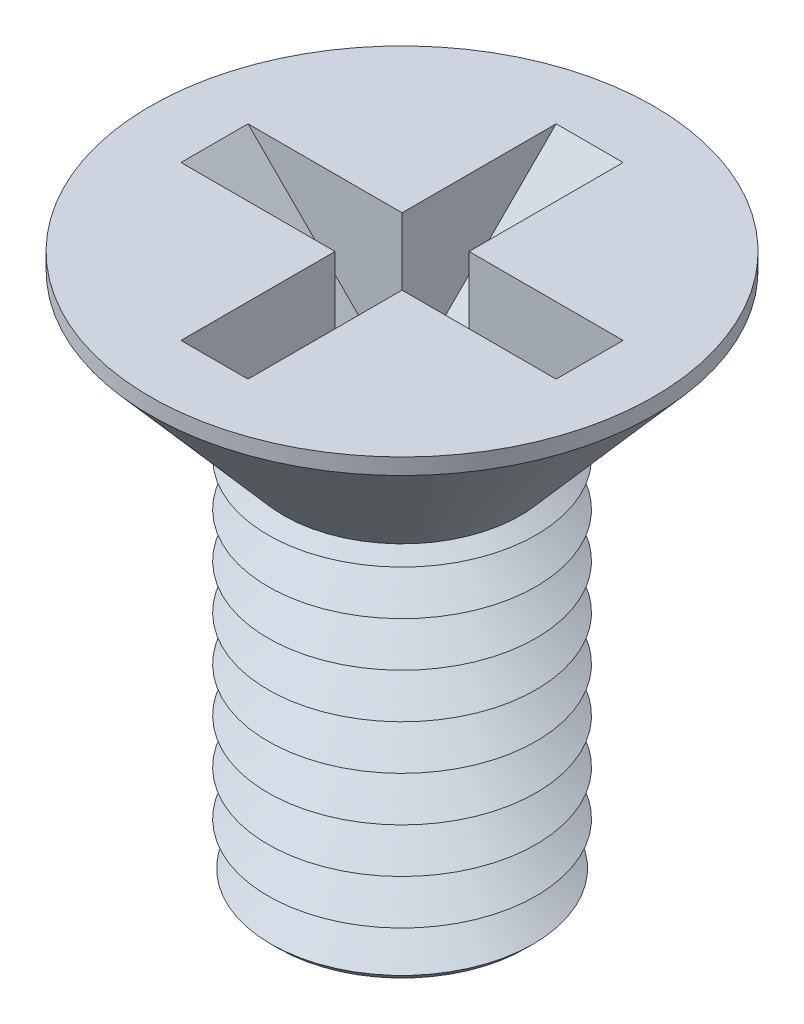
ISO-10303-21;
HEADER;
FILE_DESCRIPTION(('STEP AP214'),'2;1');
FILE_NAME('part.step','',(''),(''),'','','');
FILE_SCHEMA(('AUTOMOTIVE_DESIGN { 1 0 10303 214 1 1 1 1 }'));
ENDSEC;
DATA;
#1=APPLICATION_CONTEXT('core data for automotive mechanical design processes');
#2=APPLICATION_PROTOCOL_DEFINITION('international standard','automotive_design',2000,#1);
#3=PRODUCT_CONTEXT('',#1,'mechanical');
#4=PRODUCT('Part','Part','',(#3));
#5=PRODUCT_RELATED_PRODUCT_CATEGORY('part','',(#4));
#6=PRODUCT_DEFINITION_FORMATION('','',#4);
#7=PRODUCT_DEFINITION_CONTEXT('part definition',#1,'design');
#8=PRODUCT_DEFINITION('design','',#6,#7);
#9=PRODUCT_DEFINITION_SHAPE('','',#8);
#10=(LENGTH_UNIT() NAMED_UNIT(*) SI_UNIT(.MILLI.,.METRE.));
#11=(NAMED_UNIT(*) PLANE_ANGLE_UNIT() SI_UNIT($,.RADIAN.));
#12=(NAMED_UNIT(*) SI_UNIT($,.STERADIAN.) SOLID_ANGLE_UNIT());
#13=UNCERTAINTY_MEASURE_WITH_UNIT(LENGTH_MEASURE(1.E-05),#10,'distance_accuracy_value','');
#14=(GEOMETRIC_REPRESENTATION_CONTEXT(3) GLOBAL_UNCERTAINTY_ASSIGNED_CONTEXT((#13)) GLOBAL_UNIT_ASSIGNED_CONTEXT((#10,
#11,#12)) REPRESENTATION_CONTEXT('',''));
#15=CARTESIAN_POINT('',(0.,0.,0.));
#16=DIRECTION('',(0.,0.,1.));
#17=DIRECTION('',(1.,0.,0.));
#18=AXIS2_PLACEMENT_3D('',#15,#16,#17);
#19=CARTESIAN_POINT('',(0.762,0.,0.));
#20=DIRECTION('',(0.,1.,0.));
#21=DIRECTION('',(0.,0.,1.));
#22=AXIS2_PLACEMENT_3D('',#19,#20,#21);
#23=PLANE('',#22);
#24=CARTESIAN_POINT('',(0.,0.,0.));
#25=DIRECTION('',(0.,-1.,0.));
#26=DIRECTION('',(0.,0.,-1.));
#27=AXIS2_PLACEMENT_3D('',#24,#25,#26);
#28=CIRCLE('',#27,1.43181242069409);
#29=CARTESIAN_POINT('',(0.,0.,-1.43181242069409));
#30=VERTEX_POINT('',#29);
#31=EDGE_CURVE('E172',#30,#30,#28,.T.);
#32=ORIENTED_EDGE('',*,*,#31,.F.);
#33=EDGE_LOOP('',(#32));
#34=FACE_BOUND('',#33,.T.);
#35=DIRECTION('',(0.,0.,1.));
#36=VECTOR('',#35,1.);
#37=CARTESIAN_POINT('',(-1.06679999999999,0.,0.));
#38=LINE('',#37,#36);
#39=CARTESIAN_POINT('',(-1.06679999999999,0.,-0.190499999999996));
#40=VERTEX_POINT('',#39);
#41=CARTESIAN_POINT('',(-1.06679999999999,0.,0.190500000000004));
#42=VERTEX_POINT('',#41);
#43=EDGE_CURVE('E110',#40,#42,#38,.T.);
#44=ORIENTED_EDGE('',*,*,#43,.F.);
#45=DIRECTION('',(1.,0.,0.));
#46=VECTOR('',#45,1.);
#47=CARTESIAN_POINT('',(0.761999999999999,0.,-0.190500000000003));
#48=LINE('',#47,#46);
#49=CARTESIAN_POINT('',(-0.1905,0.,-0.190499999999999));
#50=VERTEX_POINT('',#49);
#51=EDGE_CURVE('E159',#40,#50,#48,.T.);
#52=ORIENTED_EDGE('',*,*,#51,.T.);
#53=DIRECTION('',(0.,0.,1.));
#54=VECTOR('',#53,1.);
#55=CARTESIAN_POINT('',(-0.1905,0.,0.));
#56=LINE('',#55,#54);
#57=CARTESIAN_POINT('',(-0.1905,0.,-1.06679999999999));
#58=VERTEX_POINT('',#57);
#59=EDGE_CURVE('E237',#58,#50,#56,.T.);
#60=ORIENTED_EDGE('',*,*,#59,.F.);
#61=DIRECTION('',(-1.,0.,0.));
#62=VECTOR('',#61,1.);
#63=CARTESIAN_POINT('',(0.762,0.,-1.06679999999999));
#64=LINE('',#63,#62);
#65=CARTESIAN_POINT('',(0.1905,0.,-1.06679999999999));
#66=VERTEX_POINT('',#65);
#67=EDGE_CURVE('E46',#66,#58,#64,.T.);
#68=ORIENTED_EDGE('',*,*,#67,.F.);
#69=DIRECTION('',(0.,0.,1.));
#70=VECTOR('',#69,1.);
#71=CARTESIAN_POINT('',(0.1905,0.,0.));
#72=LINE('',#71,#70);
#73=CARTESIAN_POINT('',(0.1905,0.,-0.190500000000001));
#74=VERTEX_POINT('',#73);
#75=EDGE_CURVE('E54',#66,#74,#72,.T.);
#76=ORIENTED_EDGE('',*,*,#75,.T.);
#77=CARTESIAN_POINT('',(1.06679999999999,0.,-0.190500000000011));
#78=VERTEX_POINT('',#77);
#79=EDGE_CURVE('E155',#74,#78,#48,.T.);
#80=ORIENTED_EDGE('',*,*,#79,.T.);
#81=DIRECTION('',(0.,0.,-1.));
#82=VECTOR('',#81,1.);
#83=CARTESIAN_POINT('',(1.06679999999999,0.,0.));
#84=LINE('',#83,#82);
#85=CARTESIAN_POINT('',(1.06679999999999,0.,0.190499999999989));
#86=VERTEX_POINT('',#85);
#87=EDGE_CURVE('E153',#86,#78,#84,.T.);
#88=ORIENTED_EDGE('',*,*,#87,.F.);
#89=DIRECTION('',(-1.,0.,0.));
#90=VECTOR('',#89,1.);
#91=CARTESIAN_POINT('',(0.762000000000001,0.,0.190499999999992));
#92=LINE('',#91,#90);
#93=CARTESIAN_POINT('',(0.1905,0.,0.190499999999998));
#94=VERTEX_POINT('',#93);
#95=EDGE_CURVE('E136',#86,#94,#92,.T.);
#96=ORIENTED_EDGE('',*,*,#95,.T.);
#97=DIRECTION('',(0.,0.,-1.));
#98=VECTOR('',#97,1.);
#99=CARTESIAN_POINT('',(0.1905,0.,0.));
#100=LINE('',#99,#98);
#101=CARTESIAN_POINT('',(0.1905,0.,1.06679999999999));
#102=VERTEX_POINT('',#101);
#103=EDGE_CURVE('E131',#102,#94,#100,.T.);
#104=ORIENTED_EDGE('',*,*,#103,.F.);
#105=DIRECTION('',(1.,0.,0.));
#106=VECTOR('',#105,1.);
#107=CARTESIAN_POINT('',(0.762,0.,1.06679999999999));
#108=LINE('',#107,#106);
#109=CARTESIAN_POINT('',(-0.1905,0.,1.06679999999999));
#110=VERTEX_POINT('',#109);
#111=EDGE_CURVE('E140',#110,#102,#108,.T.);
#112=ORIENTED_EDGE('',*,*,#111,.F.);
#113=DIRECTION('',(0.,0.,-1.));
#114=VECTOR('',#113,1.);
#115=CARTESIAN_POINT('',(-0.1905,0.,0.));
#116=LINE('',#115,#114);
#117=CARTESIAN_POINT('',(-0.1905,0.,0.190500000000001));
#118=VERTEX_POINT('',#117);
#119=EDGE_CURVE('E39',#110,#118,#116,.T.);
#120=ORIENTED_EDGE('',*,*,#119,.T.);
#121=DIRECTION('',(1.,0.,0.));
#122=VECTOR('',#121,1.);
#123=CARTESIAN_POINT('',(0.762,0.,0.190499999999997));
#124=LINE('',#123,#122);
#125=EDGE_CURVE('E11',#42,#118,#124,.T.);
#126=ORIENTED_EDGE('',*,*,#125,.F.);
#127=EDGE_LOOP('',(#44,#52,#60,#68,#76,#80,#88,#96,#104,#112,#120,#126));
#128=FACE_BOUND('',#127,.T.);
#129=ADVANCED_FACE('F32',(#34,#128),#23,.T.);
#130=CARTESIAN_POINT('',(-0.1905,0.508,0.));
#131=DIRECTION('',(-1.,0.,0.));
#132=DIRECTION('',(0.,0.,1.));
#133=AXIS2_PLACEMENT_3D('',#130,#131,#132);
#134=PLANE('',#133);
#135=DIRECTION('',(0.,1.,0.));
#136=VECTOR('',#135,1.);
#137=CARTESIAN_POINT('',(-0.1905,0.508,-0.190499999999999));
#138=LINE('',#137,#136);
#139=CARTESIAN_POINT('',(-0.190499999999999,-0.8763,-0.190499999999999));
#140=VERTEX_POINT('',#139);
#141=EDGE_CURVE('E158',#140,#50,#138,.T.);
#142=ORIENTED_EDGE('',*,*,#141,.F.);
#143=DIRECTION('',(0.,0.707106781186551,-0.707106781186544));
#144=VECTOR('',#143,1.);
#145=CARTESIAN_POINT('',(-0.1905,0.508,-1.57479999999998));
#146=LINE('',#145,#144);
#147=EDGE_CURVE('E164',#140,#58,#146,.T.);
#148=ORIENTED_EDGE('',*,*,#147,.T.);
#149=ORIENTED_EDGE('',*,*,#59,.T.);
#150=EDGE_LOOP('',(#142,#148,#149));
#151=FACE_BOUND('',#150,.T.);
#152=ADVANCED_FACE('F262',(#151),#134,.F.);
#153=CARTESIAN_POINT('',(0.1905,0.508,0.));
#154=DIRECTION('',(-1.,0.,0.));
#155=DIRECTION('',(0.,0.,1.));
#156=AXIS2_PLACEMENT_3D('',#153,#154,#155);
#157=PLANE('',#156);
#158=DIRECTION('',(0.,0.707106781186551,-0.707106781186544));
#159=VECTOR('',#158,1.);
#160=CARTESIAN_POINT('',(0.1905,0.508,-1.57479999999998));
#161=LINE('',#160,#159);
#162=CARTESIAN_POINT('',(0.1905,-0.8763,-0.190499999999998));
#163=VERTEX_POINT('',#162);
#164=EDGE_CURVE('E109',#163,#66,#161,.T.);
#165=ORIENTED_EDGE('',*,*,#164,.F.);
#166=DIRECTION('',(0.,1.,0.));
#167=VECTOR('',#166,1.);
#168=CARTESIAN_POINT('',(0.1905,0.508,-0.190500000000001));
#169=LINE('',#168,#167);
#170=EDGE_CURVE('E240',#163,#74,#169,.T.);
#171=ORIENTED_EDGE('',*,*,#170,.T.);
#172=ORIENTED_EDGE('',*,*,#75,.F.);
#173=EDGE_LOOP('',(#165,#171,#172));
#174=FACE_BOUND('',#173,.T.);
#175=ADVANCED_FACE('F266',(#174),#157,.T.);
#176=CARTESIAN_POINT('',(0.,-2.92100000000001,0.));
#177=DIRECTION('',(0.,-1.,0.));
#178=DIRECTION('',(0.,0.,-1.));
#179=AXIS2_PLACEMENT_3D('',#176,#177,#178);
#180=CONICAL_SURFACE('',#179,0.542029547438751,1.04719755119662);
#181=CARTESIAN_POINT('',(0.,-3.03870295474388,0.));
#182=DIRECTION('',(0.,-1.,0.));
#183=DIRECTION('',(0.,0.,-1.));
#184=AXIS2_PLACEMENT_3D('',#181,#182,#183);
#185=CIRCLE('',#184,0.745897045256119);
#186=CARTESIAN_POINT('',(0.,-3.03870295474388,-0.745897045256119));
#187=VERTEX_POINT('',#186);
#188=EDGE_CURVE('E227',#187,#187,#185,.F.);
#189=ORIENTED_EDGE('',*,*,#188,.T.);
#190=EDGE_LOOP('',(#189));
#191=FACE_BOUND('',#190,.T.);
#192=CARTESIAN_POINT('',(0.,-2.92100000000001,0.));
#193=DIRECTION('',(0.,-1.,0.));
#194=DIRECTION('',(0.,0.,-1.));
#195=AXIS2_PLACEMENT_3D('',#192,#193,#194);
#196=CIRCLE('',#195,0.542029547438751);
#197=CARTESIAN_POINT('',(0.,-2.92100000000001,-0.542029547438751));
#198=VERTEX_POINT('',#197);
#199=EDGE_CURVE('E221',#198,#198,#196,.T.);
#200=ORIENTED_EDGE('',*,*,#199,.T.);
#201=EDGE_LOOP('',(#200));
#202=FACE_BOUND('',#201,.T.);
#203=ADVANCED_FACE('F268',(#191,#202),#180,.T.);
#204=CARTESIAN_POINT('',(0.,-2.79400000000001,0.));
#205=DIRECTION('',(0.,1.,0.));
#206=DIRECTION('',(0.,0.,1.));
#207=AXIS2_PLACEMENT_3D('',#204,#205,#206);
#208=CONICAL_SURFACE('',#207,0.762,1.04719755119659);
#209=ORIENTED_EDGE('',*,*,#199,.F.);
#210=EDGE_LOOP('',(#209));
#211=FACE_BOUND('',#210,.T.);
#212=CARTESIAN_POINT('',(0.,-2.79400000000001,0.));
#213=DIRECTION('',(0.,-1.,0.));
#214=DIRECTION('',(0.,0.,-1.));
#215=AXIS2_PLACEMENT_3D('',#212,#213,#214);
#216=CIRCLE('',#215,0.762);
#217=CARTESIAN_POINT('',(0.,-2.79400000000001,-0.762));
#218=VERTEX_POINT('',#217);
#219=EDGE_CURVE('E218',#218,#218,#216,.T.);
#220=ORIENTED_EDGE('',*,*,#219,.T.);
#221=EDGE_LOOP('',(#220));
#222=FACE_BOUND('',#221,.T.);
#223=ADVANCED_FACE('F274',(#211,#222),#208,.T.);
#224=CARTESIAN_POINT('',(0.,-2.66700000000001,0.));
#225=DIRECTION('',(0.,-1.,0.));
#226=DIRECTION('',(0.,0.,-1.));
#227=AXIS2_PLACEMENT_3D('',#224,#225,#226);
#228=CONICAL_SURFACE('',#227,0.542029547438751,1.04719755119659);
#229=ORIENTED_EDGE('',*,*,#219,.F.);
#230=EDGE_LOOP('',(#229));
#231=FACE_BOUND('',#230,.T.);
#232=CARTESIAN_POINT('',(0.,-2.66700000000001,0.));
#233=DIRECTION('',(0.,-1.,0.));
#234=DIRECTION('',(0.,0.,-1.));
#235=AXIS2_PLACEMENT_3D('',#232,#233,#234);
#236=CIRCLE('',#235,0.542029547438751);
#237=CARTESIAN_POINT('',(0.,-2.66700000000001,-0.542029547438751));
#238=VERTEX_POINT('',#237);
#239=EDGE_CURVE('E215',#238,#238,#236,.T.);
#240=ORIENTED_EDGE('',*,*,#239,.T.);
#241=EDGE_LOOP('',(#240));
#242=FACE_BOUND('',#241,.T.);
#243=ADVANCED_FACE('F360',(#231,#242),#228,.T.);
#244=CARTESIAN_POINT('',(0.,-2.54000000000001,0.));
#245=DIRECTION('',(0.,1.,0.));
#246=DIRECTION('',(0.,0.,1.));
#247=AXIS2_PLACEMENT_3D('',#244,#245,#246);
#248=CONICAL_SURFACE('',#247,0.762,1.04719755119662);
#249=ORIENTED_EDGE('',*,*,#239,.F.);
#250=EDGE_LOOP('',(#249));
#251=FACE_BOUND('',#250,.T.);
#252=CARTESIAN_POINT('',(0.,-2.54000000000001,0.));
#253=DIRECTION('',(0.,-1.,0.));
#254=DIRECTION('',(0.,0.,-1.));
#255=AXIS2_PLACEMENT_3D('',#252,#253,#254);
#256=CIRCLE('',#255,0.762);
#257=CARTESIAN_POINT('',(0.,-2.54000000000001,-0.762));
#258=VERTEX_POINT('',#257);
#259=EDGE_CURVE('E212',#258,#258,#256,.T.);
#260=ORIENTED_EDGE('',*,*,#259,.T.);
#261=EDGE_LOOP('',(#260));
#262=FACE_BOUND('',#261,.T.);
#263=ADVANCED_FACE('F356',(#251,#262),#248,.T.);
#264=CARTESIAN_POINT('',(0.,-2.41300000000001,0.));
#265=DIRECTION('',(0.,-1.,0.));
#266=DIRECTION('',(0.,0.,-1.));
#267=AXIS2_PLACEMENT_3D('',#264,#265,#266);
#268=CONICAL_SURFACE('',#267,0.542029547438751,1.04719755119659);
#269=ORIENTED_EDGE('',*,*,#259,.F.);
#270=EDGE_LOOP('',(#269));
#271=FACE_BOUND('',#270,.T.);
#272=CARTESIAN_POINT('',(0.,-2.41300000000001,0.));
#273=DIRECTION('',(0.,-1.,0.));
#274=DIRECTION('',(0.,0.,-1.));
#275=AXIS2_PLACEMENT_3D('',#272,#273,#274);
#276=CIRCLE('',#275,0.542029547438751);
#277=CARTESIAN_POINT('',(0.,-2.41300000000001,-0.542029547438751));
#278=VERTEX_POINT('',#277);
#279=EDGE_CURVE('E209',#278,#278,#276,.T.);
#280=ORIENTED_EDGE('',*,*,#279,.T.);
#281=EDGE_LOOP('',(#280));
#282=FACE_BOUND('',#281,.T.);
#283=ADVANCED_FACE('F352',(#271,#282),#268,.T.);
#284=CARTESIAN_POINT('',(0.,-2.28600000000001,0.));
#285=DIRECTION('',(0.,1.,0.));
#286=DIRECTION('',(0.,0.,1.));
#287=AXIS2_PLACEMENT_3D('',#284,#285,#286);
#288=CONICAL_SURFACE('',#287,0.762,1.04719755119659);
#289=ORIENTED_EDGE('',*,*,#279,.F.);
#290=EDGE_LOOP('',(#289));
#291=FACE_BOUND('',#290,.T.);
#292=CARTESIAN_POINT('',(0.,-2.28600000000001,0.));
#293=DIRECTION('',(0.,-1.,0.));
#294=DIRECTION('',(0.,0.,-1.));
#295=AXIS2_PLACEMENT_3D('',#292,#293,#294);
#296=CIRCLE('',#295,0.762);
#297=CARTESIAN_POINT('',(0.,-2.28600000000001,-0.762));
#298=VERTEX_POINT('',#297);
#299=EDGE_CURVE('E206',#298,#298,#296,.T.);
#300=ORIENTED_EDGE('',*,*,#299,.T.);
#301=EDGE_LOOP('',(#300));
#302=FACE_BOUND('',#301,.T.);
#303=ADVANCED_FACE('F348',(#291,#302),#288,.T.);
#304=CARTESIAN_POINT('',(0.,-2.15900000000001,0.));
#305=DIRECTION('',(0.,-1.,0.));
#306=DIRECTION('',(0.,0.,-1.));
#307=AXIS2_PLACEMENT_3D('',#304,#305,#306);
#308=CONICAL_SURFACE('',#307,0.542029547438751,1.04719755119659);
#309=ORIENTED_EDGE('',*,*,#299,.F.);
#310=EDGE_LOOP('',(#309));
#311=FACE_BOUND('',#310,.T.);
#312=CARTESIAN_POINT('',(0.,-2.15900000000001,0.));
#313=DIRECTION('',(0.,-1.,0.));
#314=DIRECTION('',(0.,0.,-1.));
#315=AXIS2_PLACEMENT_3D('',#312,#313,#314);
#316=CIRCLE('',#315,0.542029547438751);
#317=CARTESIAN_POINT('',(0.,-2.15900000000001,-0.542029547438751));
#318=VERTEX_POINT('',#317);
#319=EDGE_CURVE('E203',#318,#318,#316,.T.);
#320=ORIENTED_EDGE('',*,*,#319,.T.);
#321=EDGE_LOOP('',(#320));
#322=FACE_BOUND('',#321,.T.);
#323=ADVANCED_FACE('F344',(#311,#322),#308,.T.);
#324=CARTESIAN_POINT('',(0.,-2.03200000000001,0.));
#325=DIRECTION('',(0.,1.,0.));
#326=DIRECTION('',(0.,0.,1.));
#327=AXIS2_PLACEMENT_3D('',#324,#325,#326);
#328=CONICAL_SURFACE('',#327,0.762,1.04719755119659);
#329=ORIENTED_EDGE('',*,*,#319,.F.);
#330=EDGE_LOOP('',(#329));
#331=FACE_BOUND('',#330,.T.);
#332=CARTESIAN_POINT('',(0.,-2.03200000000001,0.));
#333=DIRECTION('',(0.,-1.,0.));
#334=DIRECTION('',(0.,0.,-1.));
#335=AXIS2_PLACEMENT_3D('',#332,#333,#334);
#336=CIRCLE('',#335,0.762);
#337=CARTESIAN_POINT('',(0.,-2.03200000000001,-0.762));
#338=VERTEX_POINT('',#337);
#339=EDGE_CURVE('E200',#338,#338,#336,.T.);
#340=ORIENTED_EDGE('',*,*,#339,.T.);
#341=EDGE_LOOP('',(#340));
#342=FACE_BOUND('',#341,.T.);
#343=ADVANCED_FACE('F340',(#331,#342),#328,.T.);
#344=CARTESIAN_POINT('',(0.,-1.90500000000001,0.));
#345=DIRECTION('',(0.,-1.,0.));
#346=DIRECTION('',(0.,0.,-1.));
#347=AXIS2_PLACEMENT_3D('',#344,#345,#346);
#348=CONICAL_SURFACE('',#347,0.542029547438751,1.04719755119662);
#349=ORIENTED_EDGE('',*,*,#339,.F.);
#350=EDGE_LOOP('',(#349));
#351=FACE_BOUND('',#350,.T.);
#352=CARTESIAN_POINT('',(0.,-1.90500000000001,0.));
#353=DIRECTION('',(0.,-1.,0.));
#354=DIRECTION('',(0.,0.,-1.));
#355=AXIS2_PLACEMENT_3D('',#352,#353,#354);
#356=CIRCLE('',#355,0.542029547438751);
#357=CARTESIAN_POINT('',(0.,-1.90500000000001,-0.542029547438751));
#358=VERTEX_POINT('',#357);
#359=EDGE_CURVE('E197',#358,#358,#356,.T.);
#360=ORIENTED_EDGE('',*,*,#359,.T.);
#361=EDGE_LOOP('',(#360));
#362=FACE_BOUND('',#361,.T.);
#363=ADVANCED_FACE('F336',(#351,#362),#348,.T.);
#364=CARTESIAN_POINT('',(0.,-1.77800000000001,0.));
#365=DIRECTION('',(0.,1.,0.));
#366=DIRECTION('',(0.,0.,1.));
#367=AXIS2_PLACEMENT_3D('',#364,#365,#366);
#368=CONICAL_SURFACE('',#367,0.762,1.04719755119659);
#369=ORIENTED_EDGE('',*,*,#359,.F.);
#370=EDGE_LOOP('',(#369));
#371=FACE_BOUND('',#370,.T.);
#372=CARTESIAN_POINT('',(0.,-1.77800000000001,0.));
#373=DIRECTION('',(0.,-1.,0.));
#374=DIRECTION('',(0.,0.,-1.));
#375=AXIS2_PLACEMENT_3D('',#372,#373,#374);
#376=CIRCLE('',#375,0.762);
#377=CARTESIAN_POINT('',(0.,-1.77800000000001,-0.762));
#378=VERTEX_POINT('',#377);
#379=EDGE_CURVE('E194',#378,#378,#376,.T.);
#380=ORIENTED_EDGE('',*,*,#379,.T.);
#381=EDGE_LOOP('',(#380));
#382=FACE_BOUND('',#381,.T.);
#383=ADVANCED_FACE('F332',(#371,#382),#368,.T.);
#384=CARTESIAN_POINT('',(0.,-1.65100000000001,0.));
#385=DIRECTION('',(0.,-1.,0.));
#386=DIRECTION('',(0.,0.,-1.));
#387=AXIS2_PLACEMENT_3D('',#384,#385,#386);
#388=CONICAL_SURFACE('',#387,0.542029547438751,1.04719755119659);
#389=ORIENTED_EDGE('',*,*,#379,.F.);
#390=EDGE_LOOP('',(#389));
#391=FACE_BOUND('',#390,.T.);
#392=CARTESIAN_POINT('',(0.,-1.65100000000001,0.));
#393=DIRECTION('',(0.,-1.,0.));
#394=DIRECTION('',(0.,0.,-1.));
#395=AXIS2_PLACEMENT_3D('',#392,#393,#394);
#396=CIRCLE('',#395,0.542029547438751);
#397=CARTESIAN_POINT('',(0.,-1.65100000000001,-0.542029547438751));
#398=VERTEX_POINT('',#397);
#399=EDGE_CURVE('E191',#398,#398,#396,.T.);
#400=ORIENTED_EDGE('',*,*,#399,.T.);
#401=EDGE_LOOP('',(#400));
#402=FACE_BOUND('',#401,.T.);
#403=ADVANCED_FACE('F328',(#391,#402),#388,.T.);
#404=CARTESIAN_POINT('',(0.,-1.52400000000001,0.));
#405=DIRECTION('',(0.,1.,0.));
#406=DIRECTION('',(0.,0.,1.));
#407=AXIS2_PLACEMENT_3D('',#404,#405,#406);
#408=CONICAL_SURFACE('',#407,0.762,1.04719755119662);
#409=ORIENTED_EDGE('',*,*,#399,.F.);
#410=EDGE_LOOP('',(#409));
#411=FACE_BOUND('',#410,.T.);
#412=CARTESIAN_POINT('',(0.,-1.52400000000001,0.));
#413=DIRECTION('',(0.,-1.,0.));
#414=DIRECTION('',(0.,0.,-1.));
#415=AXIS2_PLACEMENT_3D('',#412,#413,#414);
#416=CIRCLE('',#415,0.762);
#417=CARTESIAN_POINT('',(0.,-1.52400000000001,-0.762));
#418=VERTEX_POINT('',#417);
#419=EDGE_CURVE('E188',#418,#418,#416,.T.);
#420=ORIENTED_EDGE('',*,*,#419,.T.);
#421=EDGE_LOOP('',(#420));
#422=FACE_BOUND('',#421,.T.);
#423=ADVANCED_FACE('F324',(#411,#422),#408,.T.);
#424=CARTESIAN_POINT('',(0.,-1.39700000000001,0.));
#425=DIRECTION('',(0.,-1.,0.));
#426=DIRECTION('',(0.,0.,-1.));
#427=AXIS2_PLACEMENT_3D('',#424,#425,#426);
#428=CONICAL_SURFACE('',#427,0.542029547438751,1.04719755119659);
#429=ORIENTED_EDGE('',*,*,#419,.F.);
#430=EDGE_LOOP('',(#429));
#431=FACE_BOUND('',#430,.T.);
#432=CARTESIAN_POINT('',(0.,-1.39700000000001,0.));
#433=DIRECTION('',(0.,-1.,0.));
#434=DIRECTION('',(0.,0.,-1.));
#435=AXIS2_PLACEMENT_3D('',#432,#433,#434);
#436=CIRCLE('',#435,0.542029547438751);
#437=CARTESIAN_POINT('',(0.,-1.39700000000001,-0.542029547438751));
#438=VERTEX_POINT('',#437);
#439=EDGE_CURVE('E185',#438,#438,#436,.T.);
#440=ORIENTED_EDGE('',*,*,#439,.T.);
#441=EDGE_LOOP('',(#440));
#442=FACE_BOUND('',#441,.T.);
#443=ADVANCED_FACE('F320',(#431,#442),#428,.T.);
#444=CARTESIAN_POINT('',(0.,-1.27000000000001,0.));
#445=DIRECTION('',(0.,1.,0.));
#446=DIRECTION('',(0.,0.,1.));
#447=AXIS2_PLACEMENT_3D('',#444,#445,#446);
#448=CONICAL_SURFACE('',#447,0.762,1.04719755119659);
#449=ORIENTED_EDGE('',*,*,#439,.F.);
#450=EDGE_LOOP('',(#449));
#451=FACE_BOUND('',#450,.T.);
#452=CARTESIAN_POINT('',(0.,-1.27000000000001,0.));
#453=DIRECTION('',(0.,-1.,0.));
#454=DIRECTION('',(0.,0.,-1.));
#455=AXIS2_PLACEMENT_3D('',#452,#453,#454);
#456=CIRCLE('',#455,0.762);
#457=CARTESIAN_POINT('',(0.,-1.27000000000001,-0.762));
#458=VERTEX_POINT('',#457);
#459=EDGE_CURVE('E182',#458,#458,#456,.T.);
#460=ORIENTED_EDGE('',*,*,#459,.T.);
#461=EDGE_LOOP('',(#460));
#462=FACE_BOUND('',#461,.T.);
#463=ADVANCED_FACE('F313',(#451,#462),#448,.T.);
#464=CARTESIAN_POINT('',(0.,-1.14300000000001,0.));
#465=DIRECTION('',(0.,-1.,0.));
#466=DIRECTION('',(0.,0.,-1.));
#467=AXIS2_PLACEMENT_3D('',#464,#465,#466);
#468=CONICAL_SURFACE('',#467,0.542029547438751,1.04719755119659);
#469=ORIENTED_EDGE('',*,*,#459,.F.);
#470=EDGE_LOOP('',(#469));
#471=FACE_BOUND('',#470,.T.);
#472=CARTESIAN_POINT('',(0.,-1.14300000000001,0.));
#473=DIRECTION('',(0.,-1.,0.));
#474=DIRECTION('',(0.,0.,-1.));
#475=AXIS2_PLACEMENT_3D('',#472,#473,#474);
#476=CIRCLE('',#475,0.542029547438751);
#477=CARTESIAN_POINT('',(0.,-1.14300000000001,-0.542029547438751));
#478=VERTEX_POINT('',#477);
#479=EDGE_CURVE('E179',#478,#478,#476,.T.);
#480=ORIENTED_EDGE('',*,*,#479,.T.);
#481=EDGE_LOOP('',(#480));
#482=FACE_BOUND('',#481,.T.);
#483=ADVANCED_FACE('F307',(#471,#482),#468,.T.);
#484=CARTESIAN_POINT('',(0.,-1.016,0.));
#485=DIRECTION('',(0.,1.,0.));
#486=DIRECTION('',(0.,0.,1.));
#487=AXIS2_PLACEMENT_3D('',#484,#485,#486);
#488=CONICAL_SURFACE('',#487,0.762,1.04719755119659);
#489=ORIENTED_EDGE('',*,*,#479,.F.);
#490=EDGE_LOOP('',(#489));
#491=FACE_BOUND('',#490,.T.);
#492=CARTESIAN_POINT('',(0.,-1.016,0.));
#493=DIRECTION('',(0.,-1.,0.));
#494=DIRECTION('',(0.,0.,-1.));
#495=AXIS2_PLACEMENT_3D('',#492,#493,#494);
#496=CIRCLE('',#495,0.762);
#497=CARTESIAN_POINT('',(0.,-1.016,-0.762));
#498=VERTEX_POINT('',#497);
#499=EDGE_CURVE('E176',#498,#498,#496,.T.);
#500=ORIENTED_EDGE('',*,*,#499,.T.);
#501=EDGE_LOOP('',(#500));
#502=FACE_BOUND('',#501,.T.);
#503=ADVANCED_FACE('F302',(#491,#502),#488,.T.);
#504=CARTESIAN_POINT('',(0.,-0.889000000000008,0.));
#505=DIRECTION('',(0.,-1.,0.));
#506=DIRECTION('',(0.,0.,-1.));
#507=AXIS2_PLACEMENT_3D('',#504,#505,#506);
#508=CONICAL_SURFACE('',#507,0.542029547438751,1.04719755119662);
#509=CARTESIAN_POINT('',(0.,-0.964528276978587,0.));
#510=DIRECTION('',(0.,1.,0.));
#511=DIRECTION('',(0.,0.,1.));
#512=AXIS2_PLACEMENT_3D('',#509,#510,#511);
#513=CIRCLE('',#512,0.67284836057379);
#514=CARTESIAN_POINT('',(0.,-0.964528276978587,0.67284836057379));
#515=VERTEX_POINT('',#514);
#516=EDGE_CURVE('E175',#515,#515,#513,.F.);
#517=ORIENTED_EDGE('',*,*,#516,.T.);
#518=EDGE_LOOP('',(#517));
#519=FACE_BOUND('',#518,.T.);
#520=ORIENTED_EDGE('',*,*,#499,.F.);
#521=EDGE_LOOP('',(#520));
#522=FACE_BOUND('',#521,.T.);
#523=ADVANCED_FACE('F298',(#519,#522),#508,.T.);
#524=CARTESIAN_POINT('',(0.,-3.175,0.));
#525=DIRECTION('',(0.,1.,0.));
#526=DIRECTION('',(0.,0.,1.));
#527=AXIS2_PLACEMENT_3D('',#524,#525,#526);
#528=CONICAL_SURFACE('',#527,0.6096,0.785398163397457);
#529=CARTESIAN_POINT('',(0.,-3.08269704525615,0.));
#530=DIRECTION('',(0.,1.,0.));
#531=DIRECTION('',(0.,0.,1.));
#532=AXIS2_PLACEMENT_3D('',#529,#530,#531);
#533=CIRCLE('',#532,0.701902954743851);
#534=CARTESIAN_POINT('',(0.,-3.08269704525615,0.701902954743851));
#535=VERTEX_POINT('',#534);
#536=EDGE_CURVE('E230',#535,#535,#533,.F.);
#537=ORIENTED_EDGE('',*,*,#536,.F.);
#538=EDGE_LOOP('',(#537));
#539=FACE_BOUND('',#538,.T.);
#540=ORIENTED_EDGE('',*,*,#188,.F.);
#541=EDGE_LOOP('',(#540));
#542=FACE_BOUND('',#541,.T.);
#543=ADVANCED_FACE('F301',(#539,#542),#528,.T.);
#544=CARTESIAN_POINT('',(0.,-3.04800000000001,0.));
#545=DIRECTION('',(0.,1.,0.));
#546=DIRECTION('',(0.,0.,1.));
#547=AXIS2_PLACEMENT_3D('',#544,#545,#546);
#548=CONICAL_SURFACE('',#547,0.762,1.04719755119659);
#549=ORIENTED_EDGE('',*,*,#536,.T.);
#550=EDGE_LOOP('',(#549));
#551=FACE_BOUND('',#550,.T.);
#552=CARTESIAN_POINT('',(0.,-3.17500000000001,0.));
#553=DIRECTION('',(0.,-1.,0.));
#554=DIRECTION('',(0.,0.,-1.));
#555=AXIS2_PLACEMENT_3D('',#552,#553,#554);
#556=CIRCLE('',#555,0.542029547438751);
#557=CARTESIAN_POINT('',(0.,-3.17500000000001,-0.542029547438751));
#558=VERTEX_POINT('',#557);
#559=EDGE_CURVE('E224',#558,#558,#556,.T.);
#560=ORIENTED_EDGE('',*,*,#559,.F.);
#561=EDGE_LOOP('',(#560));
#562=FACE_BOUND('',#561,.T.);
#563=ADVANCED_FACE('F368',(#551,#562),#548,.T.);
#564=CARTESIAN_POINT('',(0.,-3.175,0.));
#565=DIRECTION('',(0.,-1.,0.));
#566=DIRECTION('',(0.,0.,-1.));
#567=AXIS2_PLACEMENT_3D('',#564,#565,#566);
#568=PLANE('',#567);
#569=ORIENTED_EDGE('',*,*,#559,.T.);
#570=EDGE_LOOP('',(#569));
#571=FACE_BOUND('',#570,.T.);
#572=ADVANCED_FACE('F294',(#571),#568,.T.);
#573=CARTESIAN_POINT('',(0.,-1.73855177383313,0.));
#574=DIRECTION('',(0.,1.,0.));
#575=DIRECTION('',(0.,0.,1.));
#576=AXIS2_PLACEMENT_3D('',#573,#574,#575);
#577=CONICAL_SURFACE('',#576,0.,0.715584993317668);
#578=CARTESIAN_POINT('',(0.,-0.0914399999999982,0.));
#579=DIRECTION('',(0.,-1.,0.));
#580=DIRECTION('',(0.,0.,-1.));
#581=AXIS2_PLACEMENT_3D('',#578,#579,#580);
#582=CIRCLE('',#581,1.43181242069409);
#583=CARTESIAN_POINT('',(0.,-0.0914399999999982,-1.43181242069409));
#584=VERTEX_POINT('',#583);
#585=EDGE_CURVE('E169',#584,#584,#582,.T.);
#586=ORIENTED_EDGE('',*,*,#585,.T.);
#587=EDGE_LOOP('',(#586));
#588=FACE_BOUND('',#587,.T.);
#589=ORIENTED_EDGE('',*,*,#516,.F.);
#590=EDGE_LOOP('',(#589));
#591=FACE_BOUND('',#590,.T.);
#592=ADVANCED_FACE('F288',(#588,#591),#577,.T.);
#593=CARTESIAN_POINT('',(0.,-50.,0.));
#594=DIRECTION('',(0.,-1.,0.));
#595=DIRECTION('',(0.,0.,-1.));
#596=AXIS2_PLACEMENT_3D('',#593,#594,#595);
#597=CYLINDRICAL_SURFACE('',#596,1.43181242069409);
#598=ORIENTED_EDGE('',*,*,#31,.T.);
#599=EDGE_LOOP('',(#598));
#600=FACE_BOUND('',#599,.T.);
#601=ORIENTED_EDGE('',*,*,#585,.F.);
#602=EDGE_LOOP('',(#601));
#603=FACE_BOUND('',#602,.T.);
#604=ADVANCED_FACE('F285',(#600,#603),#597,.T.);
#605=CARTESIAN_POINT('',(-0.1905,0.508,-1.57479999999998));
#606=DIRECTION('',(0.,-0.707106781186544,-0.707106781186551));
#607=DIRECTION('',(0.,0.707106781186551,-0.707106781186544));
#608=AXIS2_PLACEMENT_3D('',#605,#606,#607);
#609=PLANE('',#608);
#610=ORIENTED_EDGE('',*,*,#67,.T.);
#611=ORIENTED_EDGE('',*,*,#147,.F.);
#612=DIRECTION('',(1.,0.,0.));
#613=VECTOR('',#612,1.);
#614=CARTESIAN_POINT('',(-0.1905,-0.8763,-0.190499999999998));
#615=LINE('',#614,#613);
#616=EDGE_CURVE('E166',#140,#163,#615,.T.);
#617=ORIENTED_EDGE('',*,*,#616,.T.);
#618=ORIENTED_EDGE('',*,*,#164,.T.);
#619=EDGE_LOOP('',(#610,#611,#617,#618));
#620=FACE_BOUND('',#619,.T.);
#621=ADVANCED_FACE('F263',(#620),#609,.F.);
#622=CARTESIAN_POINT('',(-0.1905,-0.8763,-0.190499999999998));
#623=DIRECTION('',(0.,-1.,0.));
#624=DIRECTION('',(0.,0.,-1.));
#625=AXIS2_PLACEMENT_3D('',#622,#623,#624);
#626=PLANE('',#625);
#627=ORIENTED_EDGE('',*,*,#616,.F.);
#628=DIRECTION('',(0.,0.,-1.));
#629=VECTOR('',#628,1.);
#630=CARTESIAN_POINT('',(-0.1905,-0.8763,-0.190499999999998));
#631=LINE('',#630,#629);
#632=CARTESIAN_POINT('',(-0.1905,-0.8763,0.190499999999998));
#633=VERTEX_POINT('',#632);
#634=EDGE_CURVE('E116',#633,#140,#631,.T.);
#635=ORIENTED_EDGE('',*,*,#634,.F.);
#636=DIRECTION('',(-1.,0.,0.));
#637=VECTOR('',#636,1.);
#638=CARTESIAN_POINT('',(-0.190499999999998,-0.8763,0.190500000000001));
#639=LINE('',#638,#637);
#640=CARTESIAN_POINT('',(0.1905,-0.8763,0.190499999999998));
#641=VERTEX_POINT('',#640);
#642=EDGE_CURVE('E113',#641,#633,#639,.T.);
#643=ORIENTED_EDGE('',*,*,#642,.F.);
#644=DIRECTION('',(0.,0.,-1.));
#645=VECTOR('',#644,1.);
#646=CARTESIAN_POINT('',(0.1905,-0.8763,-0.190499999999998));
#647=LINE('',#646,#645);
#648=EDGE_CURVE('E98',#641,#163,#647,.T.);
#649=ORIENTED_EDGE('',*,*,#648,.T.);
#650=EDGE_LOOP('',(#627,#635,#643,#649));
#651=FACE_BOUND('',#650,.T.);
#652=ADVANCED_FACE('F115',(#651),#626,.F.);
#653=CARTESIAN_POINT('',(0.,0.508,-0.1905));
#654=DIRECTION('',(0.,0.,1.));
#655=DIRECTION('',(1.,0.,0.));
#656=AXIS2_PLACEMENT_3D('',#653,#654,#655);
#657=PLANE('',#656);
#658=DIRECTION('',(-0.707106781186544,0.707106781186551,0.));
#659=VECTOR('',#658,1.);
#660=CARTESIAN_POINT('',(-1.57479999999998,0.508,-0.190499999999995));
#661=LINE('',#660,#659);
#662=EDGE_CURVE('E122',#140,#40,#661,.T.);
#663=ORIENTED_EDGE('',*,*,#662,.F.);
#664=ORIENTED_EDGE('',*,*,#141,.T.);
#665=ORIENTED_EDGE('',*,*,#51,.F.);
#666=EDGE_LOOP('',(#663,#664,#665));
#667=FACE_BOUND('',#666,.T.);
#668=ADVANCED_FACE('F403',(#667),#657,.T.);
#669=CARTESIAN_POINT('',(0.,0.508,0.1905));
#670=DIRECTION('',(0.,0.,1.));
#671=DIRECTION('',(1.,0.,0.));
#672=AXIS2_PLACEMENT_3D('',#669,#670,#671);
#673=PLANE('',#672);
#674=ORIENTED_EDGE('',*,*,#125,.T.);
#675=DIRECTION('',(0.,1.,0.));
#676=VECTOR('',#675,1.);
#677=CARTESIAN_POINT('',(-0.1905,0.508,0.190500000000001));
#678=LINE('',#677,#676);
#679=EDGE_CURVE('E150',#633,#118,#678,.T.);
#680=ORIENTED_EDGE('',*,*,#679,.F.);
#681=DIRECTION('',(-0.707106781186544,0.707106781186551,0.));
#682=VECTOR('',#681,1.);
#683=CARTESIAN_POINT('',(-1.57479999999998,0.508,0.190500000000005));
#684=LINE('',#683,#682);
#685=EDGE_CURVE('E121',#633,#42,#684,.T.);
#686=ORIENTED_EDGE('',*,*,#685,.T.);
#687=EDGE_LOOP('',(#674,#680,#686));
#688=FACE_BOUND('',#687,.T.);
#689=ADVANCED_FACE('F253',(#688),#673,.F.);
#690=CARTESIAN_POINT('',(-1.57479999999998,0.508,0.190500000000005));
#691=DIRECTION('',(-0.707106781186551,-0.707106781186544,0.));
#692=DIRECTION('',(0.707106781186544,-0.707106781186551,0.));
#693=AXIS2_PLACEMENT_3D('',#690,#691,#692);
#694=PLANE('',#693);
#695=ORIENTED_EDGE('',*,*,#43,.T.);
#696=ORIENTED_EDGE('',*,*,#685,.F.);
#697=ORIENTED_EDGE('',*,*,#634,.T.);
#698=ORIENTED_EDGE('',*,*,#662,.T.);
#699=EDGE_LOOP('',(#695,#696,#697,#698));
#700=FACE_BOUND('',#699,.T.);
#701=ADVANCED_FACE('F255',(#700),#694,.F.);
#702=ORIENTED_EDGE('',*,*,#170,.F.);
#703=DIRECTION('',(0.707106781186544,0.707106781186551,0.));
#704=VECTOR('',#703,1.);
#705=CARTESIAN_POINT('',(1.57479999999998,0.508,-0.190500000000016));
#706=LINE('',#705,#704);
#707=EDGE_CURVE('E105',#163,#78,#706,.T.);
#708=ORIENTED_EDGE('',*,*,#707,.T.);
#709=ORIENTED_EDGE('',*,*,#79,.F.);
#710=EDGE_LOOP('',(#702,#708,#709));
#711=FACE_BOUND('',#710,.T.);
#712=ADVANCED_FACE('F265',(#711),#657,.T.);
#713=CARTESIAN_POINT('',(0.1905,0.508,0.));
#714=DIRECTION('',(1.,0.,0.));
#715=DIRECTION('',(0.,0.,-1.));
#716=AXIS2_PLACEMENT_3D('',#713,#714,#715);
#717=PLANE('',#716);
#718=ORIENTED_EDGE('',*,*,#103,.T.);
#719=DIRECTION('',(0.,1.,0.));
#720=VECTOR('',#719,1.);
#721=CARTESIAN_POINT('',(0.1905,0.508,0.190499999999998));
#722=LINE('',#721,#720);
#723=EDGE_CURVE('E127',#641,#94,#722,.T.);
#724=ORIENTED_EDGE('',*,*,#723,.F.);
#725=DIRECTION('',(0.,0.707106781186551,0.707106781186544));
#726=VECTOR('',#725,1.);
#727=CARTESIAN_POINT('',(0.1905,0.508,1.57479999999998));
#728=LINE('',#727,#726);
#729=EDGE_CURVE('E129',#641,#102,#728,.T.);
#730=ORIENTED_EDGE('',*,*,#729,.T.);
#731=EDGE_LOOP('',(#718,#724,#730));
#732=FACE_BOUND('',#731,.T.);
#733=ADVANCED_FACE('F128',(#732),#717,.F.);
#734=CARTESIAN_POINT('',(0.1905,0.508,1.57479999999998));
#735=DIRECTION('',(0.,-0.707106781186544,0.707106781186551));
#736=DIRECTION('',(0.,-0.707106781186551,-0.707106781186544));
#737=AXIS2_PLACEMENT_3D('',#734,#735,#736);
#738=PLANE('',#737);
#739=ORIENTED_EDGE('',*,*,#111,.T.);
#740=ORIENTED_EDGE('',*,*,#729,.F.);
#741=ORIENTED_EDGE('',*,*,#642,.T.);
#742=DIRECTION('',(0.,0.707106781186551,0.707106781186544));
#743=VECTOR('',#742,1.);
#744=CARTESIAN_POINT('',(-0.1905,0.508,1.57479999999998));
#745=LINE('',#744,#743);
#746=EDGE_CURVE('E141',#633,#110,#745,.T.);
#747=ORIENTED_EDGE('',*,*,#746,.T.);
#748=EDGE_LOOP('',(#739,#740,#741,#747));
#749=FACE_BOUND('',#748,.T.);
#750=ADVANCED_FACE('F138',(#749),#738,.F.);
#751=CARTESIAN_POINT('',(-0.1905,0.508,0.));
#752=DIRECTION('',(1.,0.,0.));
#753=DIRECTION('',(0.,0.,-1.));
#754=AXIS2_PLACEMENT_3D('',#751,#752,#753);
#755=PLANE('',#754);
#756=ORIENTED_EDGE('',*,*,#746,.F.);
#757=ORIENTED_EDGE('',*,*,#679,.T.);
#758=ORIENTED_EDGE('',*,*,#119,.F.);
#759=EDGE_LOOP('',(#756,#757,#758));
#760=FACE_BOUND('',#759,.T.);
#761=ADVANCED_FACE('F250',(#760),#755,.T.);
#762=CARTESIAN_POINT('',(1.57479999999998,0.508,-0.190500000000016));
#763=DIRECTION('',(0.707106781186551,-0.707106781186544,0.));
#764=DIRECTION('',(0.707106781186544,0.707106781186551,0.));
#765=AXIS2_PLACEMENT_3D('',#762,#763,#764);
#766=PLANE('',#765);
#767=ORIENTED_EDGE('',*,*,#87,.T.);
#768=ORIENTED_EDGE('',*,*,#707,.F.);
#769=ORIENTED_EDGE('',*,*,#648,.F.);
#770=DIRECTION('',(0.707106781186544,0.707106781186551,0.));
#771=VECTOR('',#770,1.);
#772=CARTESIAN_POINT('',(1.57479999999998,0.508,0.190499999999983));
#773=LINE('',#772,#771);
#774=EDGE_CURVE('E102',#641,#86,#773,.T.);
#775=ORIENTED_EDGE('',*,*,#774,.T.);
#776=EDGE_LOOP('',(#767,#768,#769,#775));
#777=FACE_BOUND('',#776,.T.);
#778=ADVANCED_FACE('F100',(#777),#766,.F.);
#779=CARTESIAN_POINT('',(0.,0.508,0.1905));
#780=DIRECTION('',(0.,0.,-1.));
#781=DIRECTION('',(-1.,0.,0.));
#782=AXIS2_PLACEMENT_3D('',#779,#780,#781);
#783=PLANE('',#782);
#784=ORIENTED_EDGE('',*,*,#774,.F.);
#785=ORIENTED_EDGE('',*,*,#723,.T.);
#786=ORIENTED_EDGE('',*,*,#95,.F.);
#787=EDGE_LOOP('',(#784,#785,#786));
#788=FACE_BOUND('',#787,.T.);
#789=ADVANCED_FACE('F135',(#788),#783,.T.);
#790=CLOSED_SHELL('',(#129,#152,#175,#203,#223,#243,#263,#283,#303,#323,#343,#363,#383,#403,
#423,#443,#463,#483,#503,#523,#543,#563,#572,#592,#604,#621,#652,#668,#689,#701,#712,#733,#750,
#761,#778,#789));
#791=MANIFOLD_SOLID_BREP('B2',#790);
#792=ADVANCED_BREP_SHAPE_REPRESENTATION('',(#18,#791),#14);
#793=SHAPE_DEFINITION_REPRESENTATION(#9,#792);
ENDSEC;
END-ISO-10303-21;
